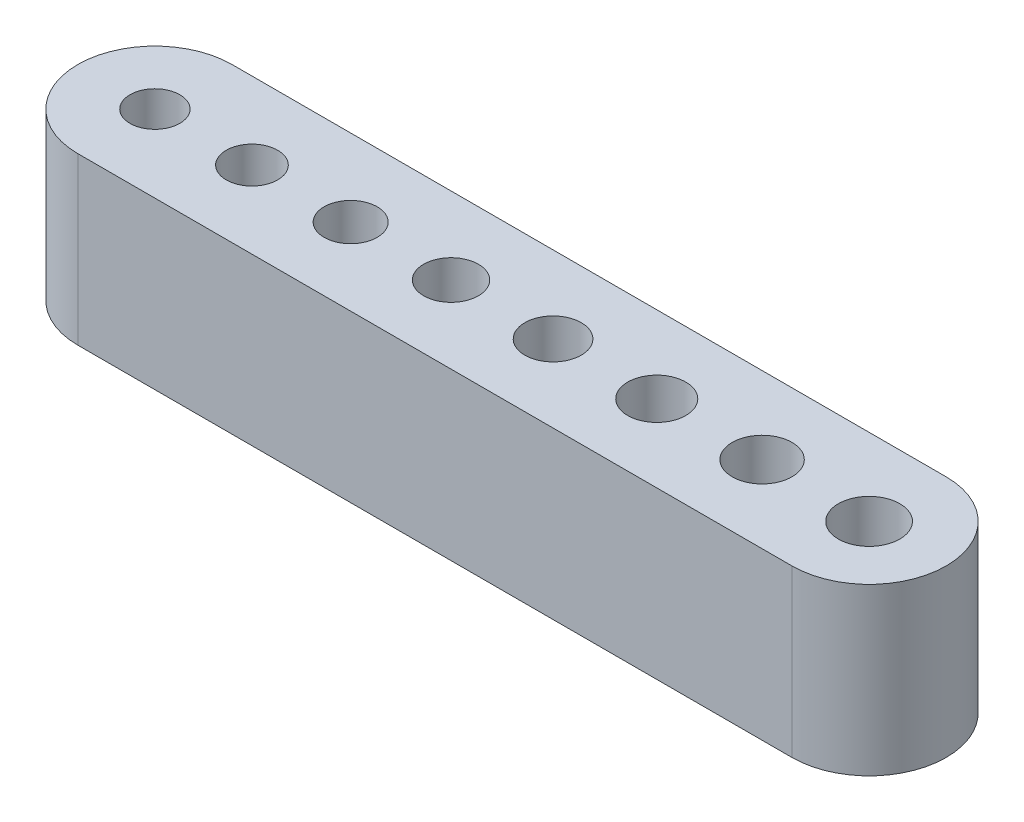
ISO-10303-21;
HEADER;
FILE_DESCRIPTION(('STEP AP214'),'2;1');
FILE_NAME('part.step','',(''),(''),'','','');
FILE_SCHEMA(('AUTOMOTIVE_DESIGN { 1 0 10303 214 1 1 1 1 }'));
ENDSEC;
DATA;
#1=APPLICATION_CONTEXT('core data for automotive mechanical design processes');
#2=APPLICATION_PROTOCOL_DEFINITION('international standard','automotive_design',2000,#1);
#3=PRODUCT_CONTEXT('',#1,'mechanical');
#4=PRODUCT('Part','Part','',(#3));
#5=PRODUCT_RELATED_PRODUCT_CATEGORY('part','',(#4));
#6=PRODUCT_DEFINITION_FORMATION('','',#4);
#7=PRODUCT_DEFINITION_CONTEXT('part definition',#1,'design');
#8=PRODUCT_DEFINITION('design','',#6,#7);
#9=PRODUCT_DEFINITION_SHAPE('','',#8);
#10=(LENGTH_UNIT() NAMED_UNIT(*) SI_UNIT(.MILLI.,.METRE.));
#11=(NAMED_UNIT(*) PLANE_ANGLE_UNIT() SI_UNIT($,.RADIAN.));
#12=(NAMED_UNIT(*) SI_UNIT($,.STERADIAN.) SOLID_ANGLE_UNIT());
#13=UNCERTAINTY_MEASURE_WITH_UNIT(LENGTH_MEASURE(1.E-05),#10,'distance_accuracy_value','');
#14=(GEOMETRIC_REPRESENTATION_CONTEXT(3) GLOBAL_UNCERTAINTY_ASSIGNED_CONTEXT((#13)) GLOBAL_UNIT_ASSIGNED_CONTEXT((#10,
#11,#12)) REPRESENTATION_CONTEXT('',''));
#15=CARTESIAN_POINT('',(0.,0.,0.));
#16=DIRECTION('',(0.,0.,1.));
#17=DIRECTION('',(1.,0.,0.));
#18=AXIS2_PLACEMENT_3D('',#15,#16,#17);
#19=CARTESIAN_POINT('',(-21.525,10.,0.));
#20=DIRECTION('',(0.,1.,0.));
#21=DIRECTION('',(0.,0.,1.));
#22=AXIS2_PLACEMENT_3D('',#19,#20,#21);
#23=PLANE('',#22);
#24=CARTESIAN_POINT('',(15.075,10.,0.));
#25=DIRECTION('',(0.,1.,0.));
#26=DIRECTION('',(0.,0.,1.));
#27=AXIS2_PLACEMENT_3D('',#24,#25,#26);
#28=CIRCLE('',#27,1.8);
#29=CARTESIAN_POINT('',(15.075,10.,1.8));
#30=VERTEX_POINT('',#29);
#31=EDGE_CURVE('E145',#30,#30,#28,.T.);
#32=ORIENTED_EDGE('',*,*,#31,.F.);
#33=EDGE_LOOP('',(#32));
#34=FACE_BOUND('',#33,.T.);
#35=CARTESIAN_POINT('',(2.475,10.,0.));
#36=DIRECTION('',(0.,1.,0.));
#37=DIRECTION('',(0.,0.,1.));
#38=AXIS2_PLACEMENT_3D('',#35,#36,#37);
#39=CIRCLE('',#38,1.7);
#40=CARTESIAN_POINT('',(2.475,10.,1.7));
#41=VERTEX_POINT('',#40);
#42=EDGE_CURVE('E133',#41,#41,#39,.T.);
#43=ORIENTED_EDGE('',*,*,#42,.F.);
#44=EDGE_LOOP('',(#43));
#45=FACE_BOUND('',#44,.T.);
#46=CARTESIAN_POINT('',(-9.725,10.,0.));
#47=DIRECTION('',(0.,1.,0.));
#48=DIRECTION('',(0.,0.,1.));
#49=AXIS2_PLACEMENT_3D('',#46,#47,#48);
#50=CIRCLE('',#49,1.6);
#51=CARTESIAN_POINT('',(-9.725,10.,1.6));
#52=VERTEX_POINT('',#51);
#53=EDGE_CURVE('E121',#52,#52,#50,.T.);
#54=ORIENTED_EDGE('',*,*,#53,.F.);
#55=EDGE_LOOP('',(#54));
#56=FACE_BOUND('',#55,.T.);
#57=CARTESIAN_POINT('',(-21.525,10.,0.));
#58=DIRECTION('',(0.,1.,0.));
#59=DIRECTION('',(0.,0.,1.));
#60=AXIS2_PLACEMENT_3D('',#57,#58,#59);
#61=CIRCLE('',#60,1.5);
#62=CARTESIAN_POINT('',(-21.525,10.,1.5));
#63=VERTEX_POINT('',#62);
#64=EDGE_CURVE('E100',#63,#63,#61,.T.);
#65=ORIENTED_EDGE('',*,*,#64,.F.);
#66=EDGE_LOOP('',(#65));
#67=FACE_BOUND('',#66,.T.);
#68=CARTESIAN_POINT('',(-21.525,10.,0.));
#69=DIRECTION('',(0.,1.,0.));
#70=DIRECTION('',(0.,0.,1.));
#71=AXIS2_PLACEMENT_3D('',#68,#69,#70);
#72=CIRCLE('',#71,4.65);
#73=CARTESIAN_POINT('',(-21.525,10.,-4.65));
#74=VERTEX_POINT('',#73);
#75=CARTESIAN_POINT('',(-21.525,10.,4.65));
#76=VERTEX_POINT('',#75);
#77=EDGE_CURVE('E85',#74,#76,#72,.T.);
#78=ORIENTED_EDGE('',*,*,#77,.T.);
#79=DIRECTION('',(1.,0.,0.));
#80=VECTOR('',#79,1.);
#81=CARTESIAN_POINT('',(-21.525,10.,4.65));
#82=LINE('',#81,#80);
#83=CARTESIAN_POINT('',(21.525,10.,4.65));
#84=VERTEX_POINT('',#83);
#85=EDGE_CURVE('E80',#76,#84,#82,.T.);
#86=ORIENTED_EDGE('',*,*,#85,.T.);
#87=CARTESIAN_POINT('',(21.525,10.,0.));
#88=DIRECTION('',(0.,1.,0.));
#89=DIRECTION('',(0.,0.,1.));
#90=AXIS2_PLACEMENT_3D('',#87,#88,#89);
#91=CIRCLE('',#90,4.65);
#92=CARTESIAN_POINT('',(21.525,10.,-4.65));
#93=VERTEX_POINT('',#92);
#94=EDGE_CURVE('E83',#84,#93,#91,.T.);
#95=ORIENTED_EDGE('',*,*,#94,.T.);
#96=DIRECTION('',(-1.,0.,0.));
#97=VECTOR('',#96,1.);
#98=CARTESIAN_POINT('',(-21.525,10.,-4.65));
#99=LINE('',#98,#97);
#100=EDGE_CURVE('E50',#93,#74,#99,.T.);
#101=ORIENTED_EDGE('',*,*,#100,.T.);
#102=EDGE_LOOP('',(#78,#86,#95,#101));
#103=FACE_BOUND('',#102,.T.);
#104=CARTESIAN_POINT('',(-15.675,10.,0.));
#105=DIRECTION('',(0.,1.,0.));
#106=DIRECTION('',(0.,0.,1.));
#107=AXIS2_PLACEMENT_3D('',#104,#105,#106);
#108=CIRCLE('',#107,1.55);
#109=CARTESIAN_POINT('',(-15.675,10.,1.55));
#110=VERTEX_POINT('',#109);
#111=EDGE_CURVE('E115',#110,#110,#108,.T.);
#112=ORIENTED_EDGE('',*,*,#111,.F.);
#113=EDGE_LOOP('',(#112));
#114=FACE_BOUND('',#113,.T.);
#115=CARTESIAN_POINT('',(-3.675,10.,0.));
#116=DIRECTION('',(0.,1.,0.));
#117=DIRECTION('',(0.,0.,1.));
#118=AXIS2_PLACEMENT_3D('',#115,#116,#117);
#119=CIRCLE('',#118,1.65);
#120=CARTESIAN_POINT('',(-3.675,10.,1.65));
#121=VERTEX_POINT('',#120);
#122=EDGE_CURVE('E127',#121,#121,#119,.T.);
#123=ORIENTED_EDGE('',*,*,#122,.F.);
#124=EDGE_LOOP('',(#123));
#125=FACE_BOUND('',#124,.T.);
#126=CARTESIAN_POINT('',(21.525,10.,0.));
#127=DIRECTION('',(0.,1.,0.));
#128=DIRECTION('',(0.,0.,1.));
#129=AXIS2_PLACEMENT_3D('',#126,#127,#128);
#130=CIRCLE('',#129,1.85);
#131=CARTESIAN_POINT('',(21.525,10.,1.85));
#132=VERTEX_POINT('',#131);
#133=EDGE_CURVE('E139',#132,#132,#130,.T.);
#134=ORIENTED_EDGE('',*,*,#133,.F.);
#135=EDGE_LOOP('',(#134));
#136=FACE_BOUND('',#135,.T.);
#137=CARTESIAN_POINT('',(8.725,10.,0.));
#138=DIRECTION('',(0.,1.,0.));
#139=DIRECTION('',(0.,0.,1.));
#140=AXIS2_PLACEMENT_3D('',#137,#138,#139);
#141=CIRCLE('',#140,1.75);
#142=CARTESIAN_POINT('',(8.725,10.,1.75));
#143=VERTEX_POINT('',#142);
#144=EDGE_CURVE('E151',#143,#143,#141,.T.);
#145=ORIENTED_EDGE('',*,*,#144,.F.);
#146=EDGE_LOOP('',(#145));
#147=FACE_BOUND('',#146,.T.);
#148=ADVANCED_FACE('F33',(#34,#45,#56,#67,#103,#114,#125,#136,#147),#23,.T.);
#149=CARTESIAN_POINT('',(-21.525,0.,0.));
#150=DIRECTION('',(0.,1.,0.));
#151=DIRECTION('',(0.,0.,1.));
#152=AXIS2_PLACEMENT_3D('',#149,#150,#151);
#153=PLANE('',#152);
#154=CARTESIAN_POINT('',(-21.525,0.,0.));
#155=DIRECTION('',(0.,1.,0.));
#156=DIRECTION('',(0.,0.,1.));
#157=AXIS2_PLACEMENT_3D('',#154,#155,#156);
#158=CIRCLE('',#157,4.65);
#159=CARTESIAN_POINT('',(-21.525,0.,-4.65));
#160=VERTEX_POINT('',#159);
#161=CARTESIAN_POINT('',(-21.525,0.,4.65));
#162=VERTEX_POINT('',#161);
#163=EDGE_CURVE('E97',#160,#162,#158,.T.);
#164=ORIENTED_EDGE('',*,*,#163,.F.);
#165=DIRECTION('',(-1.,0.,0.));
#166=VECTOR('',#165,1.);
#167=CARTESIAN_POINT('',(-21.525,0.,-4.65));
#168=LINE('',#167,#166);
#169=CARTESIAN_POINT('',(21.525,0.,-4.65));
#170=VERTEX_POINT('',#169);
#171=EDGE_CURVE('E73',#170,#160,#168,.T.);
#172=ORIENTED_EDGE('',*,*,#171,.F.);
#173=CARTESIAN_POINT('',(21.525,0.,0.));
#174=DIRECTION('',(0.,1.,0.));
#175=DIRECTION('',(0.,0.,1.));
#176=AXIS2_PLACEMENT_3D('',#173,#174,#175);
#177=CIRCLE('',#176,4.65);
#178=CARTESIAN_POINT('',(21.525,0.,4.65));
#179=VERTEX_POINT('',#178);
#180=EDGE_CURVE('E67',#179,#170,#177,.T.);
#181=ORIENTED_EDGE('',*,*,#180,.F.);
#182=DIRECTION('',(1.,0.,0.));
#183=VECTOR('',#182,1.);
#184=CARTESIAN_POINT('',(-21.525,0.,4.65));
#185=LINE('',#184,#183);
#186=EDGE_CURVE('E89',#162,#179,#185,.T.);
#187=ORIENTED_EDGE('',*,*,#186,.F.);
#188=EDGE_LOOP('',(#164,#172,#181,#187));
#189=FACE_BOUND('',#188,.T.);
#190=CARTESIAN_POINT('',(-21.525,0.,0.));
#191=DIRECTION('',(0.,1.,0.));
#192=DIRECTION('',(0.,0.,1.));
#193=AXIS2_PLACEMENT_3D('',#190,#191,#192);
#194=CIRCLE('',#193,1.5);
#195=CARTESIAN_POINT('',(-21.525,0.,1.5));
#196=VERTEX_POINT('',#195);
#197=EDGE_CURVE('E112',#196,#196,#194,.T.);
#198=ORIENTED_EDGE('',*,*,#197,.T.);
#199=EDGE_LOOP('',(#198));
#200=FACE_BOUND('',#199,.T.);
#201=CARTESIAN_POINT('',(-15.675,0.,0.));
#202=DIRECTION('',(0.,1.,0.));
#203=DIRECTION('',(0.,0.,1.));
#204=AXIS2_PLACEMENT_3D('',#201,#202,#203);
#205=CIRCLE('',#204,1.55);
#206=CARTESIAN_POINT('',(-15.675,0.,1.55));
#207=VERTEX_POINT('',#206);
#208=EDGE_CURVE('E118',#207,#207,#205,.T.);
#209=ORIENTED_EDGE('',*,*,#208,.T.);
#210=EDGE_LOOP('',(#209));
#211=FACE_BOUND('',#210,.T.);
#212=CARTESIAN_POINT('',(-9.725,0.,0.));
#213=DIRECTION('',(0.,1.,0.));
#214=DIRECTION('',(0.,0.,1.));
#215=AXIS2_PLACEMENT_3D('',#212,#213,#214);
#216=CIRCLE('',#215,1.6);
#217=CARTESIAN_POINT('',(-9.725,0.,1.6));
#218=VERTEX_POINT('',#217);
#219=EDGE_CURVE('E124',#218,#218,#216,.T.);
#220=ORIENTED_EDGE('',*,*,#219,.T.);
#221=EDGE_LOOP('',(#220));
#222=FACE_BOUND('',#221,.T.);
#223=CARTESIAN_POINT('',(-3.675,0.,0.));
#224=DIRECTION('',(0.,1.,0.));
#225=DIRECTION('',(0.,0.,1.));
#226=AXIS2_PLACEMENT_3D('',#223,#224,#225);
#227=CIRCLE('',#226,1.65);
#228=CARTESIAN_POINT('',(-3.675,0.,1.65));
#229=VERTEX_POINT('',#228);
#230=EDGE_CURVE('E130',#229,#229,#227,.T.);
#231=ORIENTED_EDGE('',*,*,#230,.T.);
#232=EDGE_LOOP('',(#231));
#233=FACE_BOUND('',#232,.T.);
#234=CARTESIAN_POINT('',(2.475,0.,0.));
#235=DIRECTION('',(0.,1.,0.));
#236=DIRECTION('',(0.,0.,1.));
#237=AXIS2_PLACEMENT_3D('',#234,#235,#236);
#238=CIRCLE('',#237,1.7);
#239=CARTESIAN_POINT('',(2.475,0.,1.7));
#240=VERTEX_POINT('',#239);
#241=EDGE_CURVE('E136',#240,#240,#238,.T.);
#242=ORIENTED_EDGE('',*,*,#241,.T.);
#243=EDGE_LOOP('',(#242));
#244=FACE_BOUND('',#243,.T.);
#245=CARTESIAN_POINT('',(21.525,0.,0.));
#246=DIRECTION('',(0.,1.,0.));
#247=DIRECTION('',(0.,0.,1.));
#248=AXIS2_PLACEMENT_3D('',#245,#246,#247);
#249=CIRCLE('',#248,1.85);
#250=CARTESIAN_POINT('',(21.525,0.,1.85));
#251=VERTEX_POINT('',#250);
#252=EDGE_CURVE('E142',#251,#251,#249,.T.);
#253=ORIENTED_EDGE('',*,*,#252,.T.);
#254=EDGE_LOOP('',(#253));
#255=FACE_BOUND('',#254,.T.);
#256=CARTESIAN_POINT('',(15.075,0.,0.));
#257=DIRECTION('',(0.,1.,0.));
#258=DIRECTION('',(0.,0.,1.));
#259=AXIS2_PLACEMENT_3D('',#256,#257,#258);
#260=CIRCLE('',#259,1.8);
#261=CARTESIAN_POINT('',(15.075,0.,1.8));
#262=VERTEX_POINT('',#261);
#263=EDGE_CURVE('E148',#262,#262,#260,.T.);
#264=ORIENTED_EDGE('',*,*,#263,.T.);
#265=EDGE_LOOP('',(#264));
#266=FACE_BOUND('',#265,.T.);
#267=CARTESIAN_POINT('',(8.725,0.,0.));
#268=DIRECTION('',(0.,1.,0.));
#269=DIRECTION('',(0.,0.,1.));
#270=AXIS2_PLACEMENT_3D('',#267,#268,#269);
#271=CIRCLE('',#270,1.75);
#272=CARTESIAN_POINT('',(8.725,0.,1.75));
#273=VERTEX_POINT('',#272);
#274=EDGE_CURVE('E154',#273,#273,#271,.T.);
#275=ORIENTED_EDGE('',*,*,#274,.T.);
#276=EDGE_LOOP('',(#275));
#277=FACE_BOUND('',#276,.T.);
#278=ADVANCED_FACE('F108',(#189,#200,#211,#222,#233,#244,#255,#266,#277),#153,.F.);
#279=CARTESIAN_POINT('',(-21.525,10.,0.));
#280=DIRECTION('',(0.,-1.,0.));
#281=DIRECTION('',(0.,0.,-1.));
#282=AXIS2_PLACEMENT_3D('',#279,#280,#281);
#283=CYLINDRICAL_SURFACE('',#282,4.65);
#284=ORIENTED_EDGE('',*,*,#163,.T.);
#285=DIRECTION('',(0.,-1.,0.));
#286=VECTOR('',#285,1.);
#287=CARTESIAN_POINT('',(-21.525,10.,4.65));
#288=LINE('',#287,#286);
#289=EDGE_CURVE('E11',#76,#162,#288,.T.);
#290=ORIENTED_EDGE('',*,*,#289,.F.);
#291=ORIENTED_EDGE('',*,*,#77,.F.);
#292=DIRECTION('',(0.,-1.,0.));
#293=VECTOR('',#292,1.);
#294=CARTESIAN_POINT('',(-21.525,10.,-4.65));
#295=LINE('',#294,#293);
#296=EDGE_CURVE('E93',#74,#160,#295,.T.);
#297=ORIENTED_EDGE('',*,*,#296,.T.);
#298=EDGE_LOOP('',(#284,#290,#291,#297));
#299=FACE_BOUND('',#298,.T.);
#300=ADVANCED_FACE('F35',(#299),#283,.T.);
#301=CARTESIAN_POINT('',(-21.525,10.,4.65));
#302=DIRECTION('',(0.,0.,-1.));
#303=DIRECTION('',(-1.,0.,0.));
#304=AXIS2_PLACEMENT_3D('',#301,#302,#303);
#305=PLANE('',#304);
#306=ORIENTED_EDGE('',*,*,#186,.T.);
#307=DIRECTION('',(0.,-1.,0.));
#308=VECTOR('',#307,1.);
#309=CARTESIAN_POINT('',(21.525,10.,4.65));
#310=LINE('',#309,#308);
#311=EDGE_CURVE('E42',#84,#179,#310,.T.);
#312=ORIENTED_EDGE('',*,*,#311,.F.);
#313=ORIENTED_EDGE('',*,*,#85,.F.);
#314=ORIENTED_EDGE('',*,*,#289,.T.);
#315=EDGE_LOOP('',(#306,#312,#313,#314));
#316=FACE_BOUND('',#315,.T.);
#317=ADVANCED_FACE('F88',(#316),#305,.F.);
#318=CARTESIAN_POINT('',(21.525,10.,0.));
#319=DIRECTION('',(0.,-1.,0.));
#320=DIRECTION('',(0.,0.,-1.));
#321=AXIS2_PLACEMENT_3D('',#318,#319,#320);
#322=CYLINDRICAL_SURFACE('',#321,4.65);
#323=ORIENTED_EDGE('',*,*,#180,.T.);
#324=DIRECTION('',(0.,-1.,0.));
#325=VECTOR('',#324,1.);
#326=CARTESIAN_POINT('',(21.525,10.,-4.65));
#327=LINE('',#326,#325);
#328=EDGE_CURVE('E90',#93,#170,#327,.T.);
#329=ORIENTED_EDGE('',*,*,#328,.F.);
#330=ORIENTED_EDGE('',*,*,#94,.F.);
#331=ORIENTED_EDGE('',*,*,#311,.T.);
#332=EDGE_LOOP('',(#323,#329,#330,#331));
#333=FACE_BOUND('',#332,.T.);
#334=ADVANCED_FACE('F91',(#333),#322,.T.);
#335=CARTESIAN_POINT('',(-21.525,10.,-4.65));
#336=DIRECTION('',(0.,0.,1.));
#337=DIRECTION('',(1.,0.,0.));
#338=AXIS2_PLACEMENT_3D('',#335,#336,#337);
#339=PLANE('',#338);
#340=ORIENTED_EDGE('',*,*,#171,.T.);
#341=ORIENTED_EDGE('',*,*,#296,.F.);
#342=ORIENTED_EDGE('',*,*,#100,.F.);
#343=ORIENTED_EDGE('',*,*,#328,.T.);
#344=EDGE_LOOP('',(#340,#341,#342,#343));
#345=FACE_BOUND('',#344,.T.);
#346=ADVANCED_FACE('F105',(#345),#339,.F.);
#347=CARTESIAN_POINT('',(-21.525,10.,0.));
#348=DIRECTION('',(0.,-1.,0.));
#349=DIRECTION('',(0.,0.,-1.));
#350=AXIS2_PLACEMENT_3D('',#347,#348,#349);
#351=CYLINDRICAL_SURFACE('',#350,1.5);
#352=ORIENTED_EDGE('',*,*,#64,.T.);
#353=EDGE_LOOP('',(#352));
#354=FACE_BOUND('',#353,.T.);
#355=ORIENTED_EDGE('',*,*,#197,.F.);
#356=EDGE_LOOP('',(#355));
#357=FACE_BOUND('',#356,.T.);
#358=ADVANCED_FACE('F173',(#354,#357),#351,.F.);
#359=CARTESIAN_POINT('',(-15.675,10.,0.));
#360=DIRECTION('',(0.,-1.,0.));
#361=DIRECTION('',(0.,0.,-1.));
#362=AXIS2_PLACEMENT_3D('',#359,#360,#361);
#363=CYLINDRICAL_SURFACE('',#362,1.55);
#364=ORIENTED_EDGE('',*,*,#111,.T.);
#365=EDGE_LOOP('',(#364));
#366=FACE_BOUND('',#365,.T.);
#367=ORIENTED_EDGE('',*,*,#208,.F.);
#368=EDGE_LOOP('',(#367));
#369=FACE_BOUND('',#368,.T.);
#370=ADVANCED_FACE('F219',(#366,#369),#363,.F.);
#371=CARTESIAN_POINT('',(-9.725,10.,0.));
#372=DIRECTION('',(0.,-1.,0.));
#373=DIRECTION('',(0.,0.,-1.));
#374=AXIS2_PLACEMENT_3D('',#371,#372,#373);
#375=CYLINDRICAL_SURFACE('',#374,1.6);
#376=ORIENTED_EDGE('',*,*,#53,.T.);
#377=EDGE_LOOP('',(#376));
#378=FACE_BOUND('',#377,.T.);
#379=ORIENTED_EDGE('',*,*,#219,.F.);
#380=EDGE_LOOP('',(#379));
#381=FACE_BOUND('',#380,.T.);
#382=ADVANCED_FACE('F227',(#378,#381),#375,.F.);
#383=CARTESIAN_POINT('',(-3.675,10.,0.));
#384=DIRECTION('',(0.,-1.,0.));
#385=DIRECTION('',(0.,0.,-1.));
#386=AXIS2_PLACEMENT_3D('',#383,#384,#385);
#387=CYLINDRICAL_SURFACE('',#386,1.65);
#388=ORIENTED_EDGE('',*,*,#122,.T.);
#389=EDGE_LOOP('',(#388));
#390=FACE_BOUND('',#389,.T.);
#391=ORIENTED_EDGE('',*,*,#230,.F.);
#392=EDGE_LOOP('',(#391));
#393=FACE_BOUND('',#392,.T.);
#394=ADVANCED_FACE('F235',(#390,#393),#387,.F.);
#395=CARTESIAN_POINT('',(2.475,10.,0.));
#396=DIRECTION('',(0.,-1.,0.));
#397=DIRECTION('',(0.,0.,-1.));
#398=AXIS2_PLACEMENT_3D('',#395,#396,#397);
#399=CYLINDRICAL_SURFACE('',#398,1.7);
#400=ORIENTED_EDGE('',*,*,#42,.T.);
#401=EDGE_LOOP('',(#400));
#402=FACE_BOUND('',#401,.T.);
#403=ORIENTED_EDGE('',*,*,#241,.F.);
#404=EDGE_LOOP('',(#403));
#405=FACE_BOUND('',#404,.T.);
#406=ADVANCED_FACE('F244',(#402,#405),#399,.F.);
#407=CARTESIAN_POINT('',(21.525,10.,0.));
#408=DIRECTION('',(0.,-1.,0.));
#409=DIRECTION('',(0.,0.,-1.));
#410=AXIS2_PLACEMENT_3D('',#407,#408,#409);
#411=CYLINDRICAL_SURFACE('',#410,1.85);
#412=ORIENTED_EDGE('',*,*,#133,.T.);
#413=EDGE_LOOP('',(#412));
#414=FACE_BOUND('',#413,.T.);
#415=ORIENTED_EDGE('',*,*,#252,.F.);
#416=EDGE_LOOP('',(#415));
#417=FACE_BOUND('',#416,.T.);
#418=ADVANCED_FACE('F253',(#414,#417),#411,.F.);
#419=CARTESIAN_POINT('',(15.075,10.,0.));
#420=DIRECTION('',(0.,-1.,0.));
#421=DIRECTION('',(0.,0.,-1.));
#422=AXIS2_PLACEMENT_3D('',#419,#420,#421);
#423=CYLINDRICAL_SURFACE('',#422,1.8);
#424=ORIENTED_EDGE('',*,*,#31,.T.);
#425=EDGE_LOOP('',(#424));
#426=FACE_BOUND('',#425,.T.);
#427=ORIENTED_EDGE('',*,*,#263,.F.);
#428=EDGE_LOOP('',(#427));
#429=FACE_BOUND('',#428,.T.);
#430=ADVANCED_FACE('F262',(#426,#429),#423,.F.);
#431=CARTESIAN_POINT('',(8.725,10.,0.));
#432=DIRECTION('',(0.,-1.,0.));
#433=DIRECTION('',(0.,0.,-1.));
#434=AXIS2_PLACEMENT_3D('',#431,#432,#433);
#435=CYLINDRICAL_SURFACE('',#434,1.75);
#436=ORIENTED_EDGE('',*,*,#144,.T.);
#437=EDGE_LOOP('',(#436));
#438=FACE_BOUND('',#437,.T.);
#439=ORIENTED_EDGE('',*,*,#274,.F.);
#440=EDGE_LOOP('',(#439));
#441=FACE_BOUND('',#440,.T.);
#442=ADVANCED_FACE('F160',(#438,#441),#435,.F.);
#443=CLOSED_SHELL('',(#148,#278,#300,#317,#334,#346,#358,#370,#382,#394,#406,#418,#430,#442));
#444=MANIFOLD_SOLID_BREP('B2',#443);
#445=ADVANCED_BREP_SHAPE_REPRESENTATION('',(#18,#444),#14);
#446=SHAPE_DEFINITION_REPRESENTATION(#9,#445);
ENDSEC;
END-ISO-10303-21;
